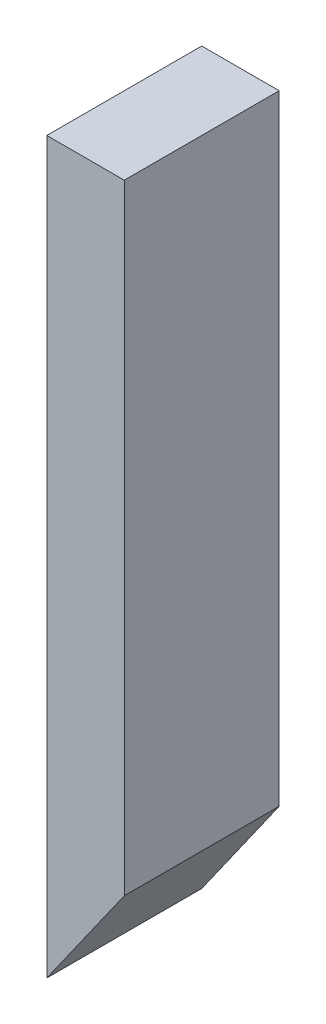
ISO-10303-21;
HEADER;
FILE_DESCRIPTION(('STEP AP214'),'2;1');
FILE_NAME('part.step','',(''),(''),'','','');
FILE_SCHEMA(('AUTOMOTIVE_DESIGN { 1 0 10303 214 1 1 1 1 }'));
ENDSEC;
DATA;
#1=APPLICATION_CONTEXT('core data for automotive mechanical design processes');
#2=APPLICATION_PROTOCOL_DEFINITION('international standard','automotive_design',2000,#1);
#3=PRODUCT_CONTEXT('',#1,'mechanical');
#4=PRODUCT('Part','Part','',(#3));
#5=PRODUCT_RELATED_PRODUCT_CATEGORY('part','',(#4));
#6=PRODUCT_DEFINITION_FORMATION('','',#4);
#7=PRODUCT_DEFINITION_CONTEXT('part definition',#1,'design');
#8=PRODUCT_DEFINITION('design','',#6,#7);
#9=PRODUCT_DEFINITION_SHAPE('','',#8);
#10=(LENGTH_UNIT() NAMED_UNIT(*) SI_UNIT(.MILLI.,.METRE.));
#11=(NAMED_UNIT(*) PLANE_ANGLE_UNIT() SI_UNIT($,.RADIAN.));
#12=(NAMED_UNIT(*) SI_UNIT($,.STERADIAN.) SOLID_ANGLE_UNIT());
#13=UNCERTAINTY_MEASURE_WITH_UNIT(LENGTH_MEASURE(1.E-05),#10,'distance_accuracy_value','');
#14=(GEOMETRIC_REPRESENTATION_CONTEXT(3) GLOBAL_UNCERTAINTY_ASSIGNED_CONTEXT((#13)) GLOBAL_UNIT_ASSIGNED_CONTEXT((#10,
#11,#12)) REPRESENTATION_CONTEXT('',''));
#15=CARTESIAN_POINT('',(0.,0.,0.));
#16=DIRECTION('',(0.,0.,1.));
#17=DIRECTION('',(1.,0.,0.));
#18=AXIS2_PLACEMENT_3D('',#15,#16,#17);
#19=CARTESIAN_POINT('',(-11.9444444444445,-26.3888888888889,10.));
#20=DIRECTION('',(1.,0.,0.));
#21=DIRECTION('',(0.,0.,-1.));
#22=AXIS2_PLACEMENT_3D('',#19,#20,#21);
#23=PLANE('',#22);
#24=DIRECTION('',(0.,-1.,0.));
#25=VECTOR('',#24,1.);
#26=CARTESIAN_POINT('',(-11.9444444444445,-26.3888888888889,0.));
#27=LINE('',#26,#25);
#28=CARTESIAN_POINT('',(-11.9444444444445,13.6111111111111,0.));
#29=VERTEX_POINT('',#28);
#30=CARTESIAN_POINT('',(-11.9444444444445,-33.4849365145757,0.));
#31=VERTEX_POINT('',#30);
#32=EDGE_CURVE('E73',#29,#31,#27,.T.);
#33=ORIENTED_EDGE('',*,*,#32,.T.);
#34=DIRECTION('',(0.,0.,-1.));
#35=VECTOR('',#34,1.);
#36=CARTESIAN_POINT('',(-11.9444444444445,-33.4849365145757,10.));
#37=LINE('',#36,#35);
#38=CARTESIAN_POINT('',(-11.9444444444445,-33.4849365145757,10.));
#39=VERTEX_POINT('',#38);
#40=EDGE_CURVE('E11',#39,#31,#37,.T.);
#41=ORIENTED_EDGE('',*,*,#40,.F.);
#42=DIRECTION('',(0.,-1.,0.));
#43=VECTOR('',#42,1.);
#44=CARTESIAN_POINT('',(-11.9444444444445,13.6111111111111,10.));
#45=LINE('',#44,#43);
#46=CARTESIAN_POINT('',(-11.9444444444445,13.6111111111111,10.));
#47=VERTEX_POINT('',#46);
#48=EDGE_CURVE('E78',#47,#39,#45,.T.);
#49=ORIENTED_EDGE('',*,*,#48,.F.);
#50=DIRECTION('',(0.,0.,-1.));
#51=VECTOR('',#50,1.);
#52=CARTESIAN_POINT('',(-11.9444444444445,13.6111111111111,10.));
#53=LINE('',#52,#51);
#54=EDGE_CURVE('E93',#47,#29,#53,.T.);
#55=ORIENTED_EDGE('',*,*,#54,.T.);
#56=EDGE_LOOP('',(#33,#41,#49,#55));
#57=FACE_BOUND('',#56,.T.);
#58=ADVANCED_FACE('F33',(#57),#23,.F.);
#59=CARTESIAN_POINT('',(-11.9444444444445,-33.4849365145757,10.));
#60=DIRECTION('',(-0.817454667145645,0.575992940201355,0.));
#61=DIRECTION('',(-0.575992940201355,-0.817454667145645,0.));
#62=AXIS2_PLACEMENT_3D('',#59,#60,#61);
#63=PLANE('',#62);
#64=DIRECTION('',(0.575992940201355,0.817454667145645,0.));
#65=VECTOR('',#64,1.);
#66=CARTESIAN_POINT('',(-11.9444444444445,-33.4849365145757,0.));
#67=LINE('',#66,#65);
#68=CARTESIAN_POINT('',(-6.94444444444446,-26.3888888888889,0.));
#69=VERTEX_POINT('',#68);
#70=EDGE_CURVE('E89',#31,#69,#67,.T.);
#71=ORIENTED_EDGE('',*,*,#70,.T.);
#72=DIRECTION('',(0.,0.,-1.));
#73=VECTOR('',#72,1.);
#74=CARTESIAN_POINT('',(-6.94444444444446,-26.3888888888889,10.));
#75=LINE('',#74,#73);
#76=CARTESIAN_POINT('',(-6.94444444444446,-26.3888888888889,10.));
#77=VERTEX_POINT('',#76);
#78=EDGE_CURVE('E41',#77,#69,#75,.T.);
#79=ORIENTED_EDGE('',*,*,#78,.F.);
#80=DIRECTION('',(0.575992940201355,0.817454667145645,0.));
#81=VECTOR('',#80,1.);
#82=CARTESIAN_POINT('',(-11.9444444444445,-33.4849365145757,10.));
#83=LINE('',#82,#81);
#84=EDGE_CURVE('E81',#39,#77,#83,.T.);
#85=ORIENTED_EDGE('',*,*,#84,.F.);
#86=ORIENTED_EDGE('',*,*,#40,.T.);
#87=EDGE_LOOP('',(#71,#79,#85,#86));
#88=FACE_BOUND('',#87,.T.);
#89=ADVANCED_FACE('F88',(#88),#63,.F.);
#90=CARTESIAN_POINT('',(-6.94444444444446,13.6111111111111,10.));
#91=DIRECTION('',(-1.,0.,0.));
#92=DIRECTION('',(0.,-1.,0.));
#93=AXIS2_PLACEMENT_3D('',#90,#91,#92);
#94=PLANE('',#93);
#95=DIRECTION('',(0.,1.,0.));
#96=VECTOR('',#95,1.);
#97=CARTESIAN_POINT('',(-6.94444444444446,13.6111111111111,0.));
#98=LINE('',#97,#96);
#99=CARTESIAN_POINT('',(-6.94444444444446,13.6111111111111,0.));
#100=VERTEX_POINT('',#99);
#101=EDGE_CURVE('E66',#69,#100,#98,.T.);
#102=ORIENTED_EDGE('',*,*,#101,.T.);
#103=DIRECTION('',(0.,0.,-1.));
#104=VECTOR('',#103,1.);
#105=CARTESIAN_POINT('',(-6.94444444444446,13.6111111111111,10.));
#106=LINE('',#105,#104);
#107=CARTESIAN_POINT('',(-6.94444444444446,13.6111111111111,10.));
#108=VERTEX_POINT('',#107);
#109=EDGE_CURVE('E90',#108,#100,#106,.T.);
#110=ORIENTED_EDGE('',*,*,#109,.F.);
#111=DIRECTION('',(0.,1.,0.));
#112=VECTOR('',#111,1.);
#113=CARTESIAN_POINT('',(-6.94444444444446,13.6111111111111,10.));
#114=LINE('',#113,#112);
#115=EDGE_CURVE('E85',#77,#108,#114,.T.);
#116=ORIENTED_EDGE('',*,*,#115,.F.);
#117=ORIENTED_EDGE('',*,*,#78,.T.);
#118=EDGE_LOOP('',(#102,#110,#116,#117));
#119=FACE_BOUND('',#118,.T.);
#120=ADVANCED_FACE('F91',(#119),#94,.F.);
#121=CARTESIAN_POINT('',(-11.9444444444445,13.6111111111111,10.));
#122=DIRECTION('',(0.,-1.,0.));
#123=DIRECTION('',(0.,0.,-1.));
#124=AXIS2_PLACEMENT_3D('',#121,#122,#123);
#125=PLANE('',#124);
#126=DIRECTION('',(-1.,0.,0.));
#127=VECTOR('',#126,1.);
#128=CARTESIAN_POINT('',(-11.9444444444445,13.6111111111111,0.));
#129=LINE('',#128,#127);
#130=EDGE_CURVE('E100',#100,#29,#129,.T.);
#131=ORIENTED_EDGE('',*,*,#130,.T.);
#132=ORIENTED_EDGE('',*,*,#54,.F.);
#133=DIRECTION('',(-1.,0.,0.));
#134=VECTOR('',#133,1.);
#135=CARTESIAN_POINT('',(-11.9444444444445,13.6111111111111,10.));
#136=LINE('',#135,#134);
#137=EDGE_CURVE('E49',#108,#47,#136,.T.);
#138=ORIENTED_EDGE('',*,*,#137,.F.);
#139=ORIENTED_EDGE('',*,*,#109,.T.);
#140=EDGE_LOOP('',(#131,#132,#138,#139));
#141=FACE_BOUND('',#140,.T.);
#142=ADVANCED_FACE('F105',(#141),#125,.F.);
#143=CARTESIAN_POINT('',(0.,0.,10.));
#144=DIRECTION('',(0.,0.,1.));
#145=DIRECTION('',(1.,0.,0.));
#146=AXIS2_PLACEMENT_3D('',#143,#144,#145);
#147=PLANE('',#146);
#148=ORIENTED_EDGE('',*,*,#48,.T.);
#149=ORIENTED_EDGE('',*,*,#84,.T.);
#150=ORIENTED_EDGE('',*,*,#115,.T.);
#151=ORIENTED_EDGE('',*,*,#137,.T.);
#152=EDGE_LOOP('',(#148,#149,#150,#151));
#153=FACE_BOUND('',#152,.T.);
#154=ADVANCED_FACE('F83',(#153),#147,.T.);
#155=CARTESIAN_POINT('',(0.,0.,0.));
#156=DIRECTION('',(0.,0.,1.));
#157=DIRECTION('',(1.,0.,0.));
#158=AXIS2_PLACEMENT_3D('',#155,#156,#157);
#159=PLANE('',#158);
#160=ORIENTED_EDGE('',*,*,#32,.F.);
#161=ORIENTED_EDGE('',*,*,#130,.F.);
#162=ORIENTED_EDGE('',*,*,#101,.F.);
#163=ORIENTED_EDGE('',*,*,#70,.F.);
#164=EDGE_LOOP('',(#160,#161,#162,#163));
#165=FACE_BOUND('',#164,.T.);
#166=ADVANCED_FACE('F106',(#165),#159,.F.);
#167=CLOSED_SHELL('',(#58,#89,#120,#142,#154,#166));
#168=MANIFOLD_SOLID_BREP('B2',#167);
#169=ADVANCED_BREP_SHAPE_REPRESENTATION('',(#18,#168),#14);
#170=SHAPE_DEFINITION_REPRESENTATION(#9,#169);
ENDSEC;
END-ISO-10303-21;
